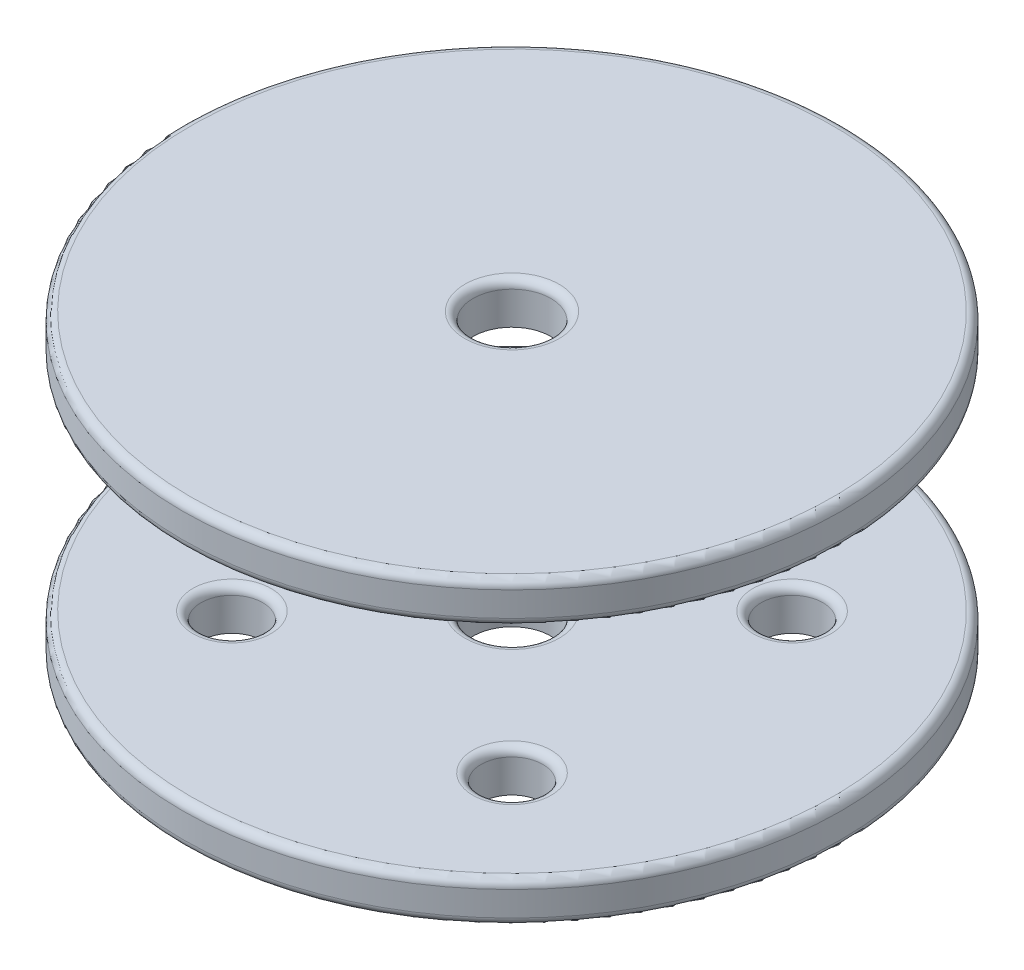
ISO-10303-21;
HEADER;
FILE_DESCRIPTION(('STEP AP214'),'2;1');
FILE_NAME('part.step','',(''),(''),'','','');
FILE_SCHEMA(('AUTOMOTIVE_DESIGN { 1 0 10303 214 1 1 1 1 }'));
ENDSEC;
DATA;
#1=APPLICATION_CONTEXT('core data for automotive mechanical design processes');
#2=APPLICATION_PROTOCOL_DEFINITION('international standard','automotive_design',2000,#1);
#3=PRODUCT_CONTEXT('',#1,'mechanical');
#4=PRODUCT('Part','Part','',(#3));
#5=PRODUCT_RELATED_PRODUCT_CATEGORY('part','',(#4));
#6=PRODUCT_DEFINITION_FORMATION('','',#4);
#7=PRODUCT_DEFINITION_CONTEXT('part definition',#1,'design');
#8=PRODUCT_DEFINITION('design','',#6,#7);
#9=PRODUCT_DEFINITION_SHAPE('','',#8);
#10=(LENGTH_UNIT() NAMED_UNIT(*) SI_UNIT(.MILLI.,.METRE.));
#11=(NAMED_UNIT(*) PLANE_ANGLE_UNIT() SI_UNIT($,.RADIAN.));
#12=(NAMED_UNIT(*) SI_UNIT($,.STERADIAN.) SOLID_ANGLE_UNIT());
#13=UNCERTAINTY_MEASURE_WITH_UNIT(LENGTH_MEASURE(1.E-05),#10,'distance_accuracy_value','');
#14=(GEOMETRIC_REPRESENTATION_CONTEXT(3) GLOBAL_UNCERTAINTY_ASSIGNED_CONTEXT((#13)) GLOBAL_UNIT_ASSIGNED_CONTEXT((#10,
#11,#12)) REPRESENTATION_CONTEXT('',''));
#15=CARTESIAN_POINT('',(0.,0.,0.));
#16=DIRECTION('',(0.,0.,1.));
#17=DIRECTION('',(1.,0.,0.));
#18=AXIS2_PLACEMENT_3D('',#15,#16,#17);
#19=CARTESIAN_POINT('',(0.,46.35000001,0.));
#20=DIRECTION('',(0.,-1.,0.));
#21=DIRECTION('',(0.,0.,-1.));
#22=AXIS2_PLACEMENT_3D('',#19,#20,#21);
#23=CYLINDRICAL_SURFACE('',#22,50.8);
#24=CARTESIAN_POINT('',(0.,41.27000001,0.));
#25=DIRECTION('',(0.,1.,0.));
#26=DIRECTION('',(0.,0.,1.));
#27=AXIS2_PLACEMENT_3D('',#24,#25,#26);
#28=CIRCLE('',#27,50.8);
#29=CARTESIAN_POINT('',(0.,41.27000001,50.8));
#30=VERTEX_POINT('',#29);
#31=EDGE_CURVE('E48',#30,#30,#28,.T.);
#32=ORIENTED_EDGE('',*,*,#31,.T.);
#33=EDGE_LOOP('',(#32));
#34=FACE_BOUND('',#33,.T.);
#35=CARTESIAN_POINT('',(0.,45.08000001,0.));
#36=DIRECTION('',(0.,1.,0.));
#37=DIRECTION('',(0.,0.,1.));
#38=AXIS2_PLACEMENT_3D('',#35,#36,#37);
#39=CIRCLE('',#38,50.8);
#40=CARTESIAN_POINT('',(0.,45.08000001,50.8));
#41=VERTEX_POINT('',#40);
#42=EDGE_CURVE('E52',#41,#41,#39,.F.);
#43=ORIENTED_EDGE('',*,*,#42,.T.);
#44=EDGE_LOOP('',(#43));
#45=FACE_BOUND('',#44,.T.);
#46=ADVANCED_FACE('F41',(#34,#45),#23,.T.);
#47=CARTESIAN_POINT('',(0.,46.35000001,0.));
#48=DIRECTION('',(0.,1.,0.));
#49=DIRECTION('',(0.,0.,1.));
#50=AXIS2_PLACEMENT_3D('',#47,#48,#49);
#51=PLANE('',#50);
#52=CARTESIAN_POINT('',(0.,46.35000001,0.));
#53=DIRECTION('',(0.,1.,0.));
#54=DIRECTION('',(0.,0.,1.));
#55=AXIS2_PLACEMENT_3D('',#52,#53,#54);
#56=CIRCLE('',#55,49.53);
#57=CARTESIAN_POINT('',(0.,46.35000001,49.53));
#58=VERTEX_POINT('',#57);
#59=EDGE_CURVE('E56',#58,#58,#56,.T.);
#60=ORIENTED_EDGE('',*,*,#59,.T.);
#61=EDGE_LOOP('',(#60));
#62=FACE_BOUND('',#61,.T.);
#63=CARTESIAN_POINT('',(0.,46.35000001,0.));
#64=DIRECTION('',(0.,1.,0.));
#65=DIRECTION('',(0.,0.,1.));
#66=AXIS2_PLACEMENT_3D('',#63,#64,#65);
#67=CIRCLE('',#66,7.27);
#68=CARTESIAN_POINT('',(0.,46.35000001,7.27));
#69=VERTEX_POINT('',#68);
#70=EDGE_CURVE('E61',#69,#69,#67,.F.);
#71=ORIENTED_EDGE('',*,*,#70,.T.);
#72=EDGE_LOOP('',(#71));
#73=FACE_BOUND('',#72,.T.);
#74=ADVANCED_FACE('F85',(#62,#73),#51,.T.);
#75=CARTESIAN_POINT('',(0.,40.00000001,0.));
#76=DIRECTION('',(0.,1.,0.));
#77=DIRECTION('',(0.,0.,1.));
#78=AXIS2_PLACEMENT_3D('',#75,#76,#77);
#79=PLANE('',#78);
#80=CARTESIAN_POINT('',(0.,40.00000001,0.));
#81=DIRECTION('',(0.,1.,0.));
#82=DIRECTION('',(0.,0.,1.));
#83=AXIS2_PLACEMENT_3D('',#80,#81,#82);
#84=CIRCLE('',#83,49.53);
#85=CARTESIAN_POINT('',(0.,40.00000001,49.53));
#86=VERTEX_POINT('',#85);
#87=EDGE_CURVE('E11',#86,#86,#84,.F.);
#88=ORIENTED_EDGE('',*,*,#87,.T.);
#89=EDGE_LOOP('',(#88));
#90=FACE_BOUND('',#89,.T.);
#91=CARTESIAN_POINT('',(0.,40.00000001,0.));
#92=DIRECTION('',(0.,1.,0.));
#93=DIRECTION('',(0.,0.,1.));
#94=AXIS2_PLACEMENT_3D('',#91,#92,#93);
#95=CIRCLE('',#94,6.);
#96=CARTESIAN_POINT('',(0.,40.00000001,6.));
#97=VERTEX_POINT('',#96);
#98=EDGE_CURVE('E67',#97,#97,#95,.T.);
#99=ORIENTED_EDGE('',*,*,#98,.T.);
#100=EDGE_LOOP('',(#99));
#101=FACE_BOUND('',#100,.T.);
#102=ADVANCED_FACE('F71',(#90,#101),#79,.F.);
#103=CARTESIAN_POINT('',(0.,46.35000001,0.));
#104=DIRECTION('',(0.,-1.,0.));
#105=DIRECTION('',(0.,0.,-1.));
#106=AXIS2_PLACEMENT_3D('',#103,#104,#105);
#107=CYLINDRICAL_SURFACE('',#106,6.);
#108=CARTESIAN_POINT('',(0.,45.08000001,0.));
#109=DIRECTION('',(0.,1.,0.));
#110=DIRECTION('',(0.,0.,1.));
#111=AXIS2_PLACEMENT_3D('',#108,#109,#110);
#112=CIRCLE('',#111,6.);
#113=CARTESIAN_POINT('',(0.,45.08000001,6.));
#114=VERTEX_POINT('',#113);
#115=EDGE_CURVE('E64',#114,#114,#112,.T.);
#116=ORIENTED_EDGE('',*,*,#115,.T.);
#117=EDGE_LOOP('',(#116));
#118=FACE_BOUND('',#117,.T.);
#119=ORIENTED_EDGE('',*,*,#98,.F.);
#120=EDGE_LOOP('',(#119));
#121=FACE_BOUND('',#120,.T.);
#122=ADVANCED_FACE('F73',(#118,#121),#107,.F.);
#123=CARTESIAN_POINT('',(0.,45.08000001,0.));
#124=DIRECTION('',(0.,1.,0.));
#125=DIRECTION('',(0.,0.,1.));
#126=AXIS2_PLACEMENT_3D('',#123,#124,#125);
#127=TOROIDAL_SURFACE('',#126,7.27,1.27);
#128=ORIENTED_EDGE('',*,*,#70,.F.);
#129=EDGE_LOOP('',(#128));
#130=FACE_BOUND('',#129,.T.);
#131=ORIENTED_EDGE('',*,*,#115,.F.);
#132=EDGE_LOOP('',(#131));
#133=FACE_BOUND('',#132,.T.);
#134=ADVANCED_FACE('F75',(#130,#133),#127,.T.);
#135=CARTESIAN_POINT('',(0.,45.08000001,0.));
#136=DIRECTION('',(0.,1.,0.));
#137=DIRECTION('',(0.,0.,1.));
#138=AXIS2_PLACEMENT_3D('',#135,#136,#137);
#139=TOROIDAL_SURFACE('',#138,49.53,1.27);
#140=ORIENTED_EDGE('',*,*,#42,.F.);
#141=EDGE_LOOP('',(#140));
#142=FACE_BOUND('',#141,.T.);
#143=ORIENTED_EDGE('',*,*,#59,.F.);
#144=EDGE_LOOP('',(#143));
#145=FACE_BOUND('',#144,.T.);
#146=ADVANCED_FACE('F82',(#142,#145),#139,.T.);
#147=CARTESIAN_POINT('',(0.,41.27000001,0.));
#148=DIRECTION('',(0.,1.,0.));
#149=DIRECTION('',(0.,0.,1.));
#150=AXIS2_PLACEMENT_3D('',#147,#148,#149);
#151=TOROIDAL_SURFACE('',#150,49.53,1.27);
#152=ORIENTED_EDGE('',*,*,#87,.F.);
#153=EDGE_LOOP('',(#152));
#154=FACE_BOUND('',#153,.T.);
#155=ORIENTED_EDGE('',*,*,#31,.F.);
#156=EDGE_LOOP('',(#155));
#157=FACE_BOUND('',#156,.T.);
#158=ADVANCED_FACE('F43',(#154,#157),#151,.T.);
#159=CLOSED_SHELL('',(#46,#74,#102,#122,#134,#146,#158));
#160=MANIFOLD_SOLID_BREP('B2',#159);
#161=CARTESIAN_POINT('',(0.,6.35,0.));
#162=DIRECTION('',(0.,-1.,0.));
#163=DIRECTION('',(0.,0.,-1.));
#164=AXIS2_PLACEMENT_3D('',#161,#162,#163);
#165=CYLINDRICAL_SURFACE('',#164,50.8);
#166=CARTESIAN_POINT('',(0.,1.27,0.));
#167=DIRECTION('',(0.,1.,0.));
#168=DIRECTION('',(0.,0.,1.));
#169=AXIS2_PLACEMENT_3D('',#166,#167,#168);
#170=CIRCLE('',#169,50.8);
#171=CARTESIAN_POINT('',(0.,1.27,50.8));
#172=VERTEX_POINT('',#171);
#173=EDGE_CURVE('E163',#172,#172,#170,.T.);
#174=ORIENTED_EDGE('',*,*,#173,.T.);
#175=EDGE_LOOP('',(#174));
#176=FACE_BOUND('',#175,.T.);
#177=CARTESIAN_POINT('',(0.,5.08,0.));
#178=DIRECTION('',(0.,1.,0.));
#179=DIRECTION('',(0.,0.,1.));
#180=AXIS2_PLACEMENT_3D('',#177,#178,#179);
#181=CIRCLE('',#180,50.8);
#182=CARTESIAN_POINT('',(0.,5.08,50.8));
#183=VERTEX_POINT('',#182);
#184=EDGE_CURVE('E168',#183,#183,#181,.F.);
#185=ORIENTED_EDGE('',*,*,#184,.T.);
#186=EDGE_LOOP('',(#185));
#187=FACE_BOUND('',#186,.T.);
#188=ADVANCED_FACE('F148',(#176,#187),#165,.T.);
#189=CARTESIAN_POINT('',(0.,6.35,0.));
#190=DIRECTION('',(0.,1.,0.));
#191=DIRECTION('',(0.,0.,1.));
#192=AXIS2_PLACEMENT_3D('',#189,#190,#191);
#193=PLANE('',#192);
#194=CARTESIAN_POINT('',(0.,6.35,0.));
#195=DIRECTION('',(0.,1.,0.));
#196=DIRECTION('',(0.,0.,1.));
#197=AXIS2_PLACEMENT_3D('',#194,#195,#196);
#198=CIRCLE('',#197,7.27);
#199=CARTESIAN_POINT('',(0.,6.35,7.27));
#200=VERTEX_POINT('',#199);
#201=EDGE_CURVE('E40',#200,#200,#198,.F.);
#202=ORIENTED_EDGE('',*,*,#201,.T.);
#203=EDGE_LOOP('',(#202));
#204=FACE_BOUND('',#203,.T.);
#205=CARTESIAN_POINT('',(0.,6.35,0.));
#206=DIRECTION('',(0.,1.,0.));
#207=DIRECTION('',(0.,0.,1.));
#208=AXIS2_PLACEMENT_3D('',#205,#206,#207);
#209=CIRCLE('',#208,49.53);
#210=CARTESIAN_POINT('',(0.,6.35,49.53));
#211=VERTEX_POINT('',#210);
#212=EDGE_CURVE('E171',#211,#211,#209,.T.);
#213=ORIENTED_EDGE('',*,*,#212,.T.);
#214=EDGE_LOOP('',(#213));
#215=FACE_BOUND('',#214,.T.);
#216=CARTESIAN_POINT('',(21.59,6.35,-21.59));
#217=DIRECTION('',(0.,1.,0.));
#218=DIRECTION('',(0.,0.,1.));
#219=AXIS2_PLACEMENT_3D('',#216,#217,#218);
#220=CIRCLE('',#219,6.0325);
#221=CARTESIAN_POINT('',(21.59,6.35,-15.5575));
#222=VERTEX_POINT('',#221);
#223=EDGE_CURVE('E183',#222,#222,#220,.F.);
#224=ORIENTED_EDGE('',*,*,#223,.T.);
#225=EDGE_LOOP('',(#224));
#226=FACE_BOUND('',#225,.T.);
#227=CARTESIAN_POINT('',(21.59,6.35,21.59));
#228=DIRECTION('',(0.,1.,0.));
#229=DIRECTION('',(0.,0.,1.));
#230=AXIS2_PLACEMENT_3D('',#227,#228,#229);
#231=CIRCLE('',#230,6.0325);
#232=CARTESIAN_POINT('',(21.59,6.35,27.6225));
#233=VERTEX_POINT('',#232);
#234=EDGE_CURVE('E186',#233,#233,#231,.F.);
#235=ORIENTED_EDGE('',*,*,#234,.T.);
#236=EDGE_LOOP('',(#235));
#237=FACE_BOUND('',#236,.T.);
#238=CARTESIAN_POINT('',(-21.59,6.35,21.59));
#239=DIRECTION('',(0.,1.,0.));
#240=DIRECTION('',(0.,0.,1.));
#241=AXIS2_PLACEMENT_3D('',#238,#239,#240);
#242=CIRCLE('',#241,6.0325);
#243=CARTESIAN_POINT('',(-21.59,6.35,27.6225));
#244=VERTEX_POINT('',#243);
#245=EDGE_CURVE('E189',#244,#244,#242,.F.);
#246=ORIENTED_EDGE('',*,*,#245,.T.);
#247=EDGE_LOOP('',(#246));
#248=FACE_BOUND('',#247,.T.);
#249=CARTESIAN_POINT('',(-21.59,6.35,-21.59));
#250=DIRECTION('',(0.,1.,0.));
#251=DIRECTION('',(0.,0.,1.));
#252=AXIS2_PLACEMENT_3D('',#249,#250,#251);
#253=CIRCLE('',#252,6.0325);
#254=CARTESIAN_POINT('',(-21.59,6.35,-15.5575));
#255=VERTEX_POINT('',#254);
#256=EDGE_CURVE('E192',#255,#255,#253,.F.);
#257=ORIENTED_EDGE('',*,*,#256,.T.);
#258=EDGE_LOOP('',(#257));
#259=FACE_BOUND('',#258,.T.);
#260=ADVANCED_FACE('F232',(#204,#215,#226,#237,#248,#259),#193,.T.);
#261=CARTESIAN_POINT('',(0.,0.,0.));
#262=DIRECTION('',(0.,1.,0.));
#263=DIRECTION('',(0.,0.,1.));
#264=AXIS2_PLACEMENT_3D('',#261,#262,#263);
#265=PLANE('',#264);
#266=CARTESIAN_POINT('',(0.,0.,0.));
#267=DIRECTION('',(0.,1.,0.));
#268=DIRECTION('',(0.,0.,1.));
#269=AXIS2_PLACEMENT_3D('',#266,#267,#268);
#270=CIRCLE('',#269,49.53);
#271=CARTESIAN_POINT('',(0.,0.,49.53));
#272=VERTEX_POINT('',#271);
#273=EDGE_CURVE('E159',#272,#272,#270,.F.);
#274=ORIENTED_EDGE('',*,*,#273,.T.);
#275=EDGE_LOOP('',(#274));
#276=FACE_BOUND('',#275,.T.);
#277=CARTESIAN_POINT('',(21.59,0.,-21.59));
#278=DIRECTION('',(0.,1.,0.));
#279=DIRECTION('',(0.,0.,-1.));
#280=AXIS2_PLACEMENT_3D('',#277,#278,#279);
#281=CIRCLE('',#280,4.7625);
#282=CARTESIAN_POINT('',(21.59,0.,-26.3525));
#283=VERTEX_POINT('',#282);
#284=EDGE_CURVE('E202',#283,#283,#281,.T.);
#285=ORIENTED_EDGE('',*,*,#284,.T.);
#286=EDGE_LOOP('',(#285));
#287=FACE_BOUND('',#286,.T.);
#288=CARTESIAN_POINT('',(21.59,0.,21.59));
#289=DIRECTION('',(0.,1.,0.));
#290=DIRECTION('',(0.,0.,1.));
#291=AXIS2_PLACEMENT_3D('',#288,#289,#290);
#292=CIRCLE('',#291,4.7625);
#293=CARTESIAN_POINT('',(21.59,0.,26.3525));
#294=VERTEX_POINT('',#293);
#295=EDGE_CURVE('E205',#294,#294,#292,.T.);
#296=ORIENTED_EDGE('',*,*,#295,.T.);
#297=EDGE_LOOP('',(#296));
#298=FACE_BOUND('',#297,.T.);
#299=CARTESIAN_POINT('',(-21.59,0.,21.59));
#300=DIRECTION('',(0.,1.,0.));
#301=DIRECTION('',(0.,0.,-1.));
#302=AXIS2_PLACEMENT_3D('',#299,#300,#301);
#303=CIRCLE('',#302,4.7625);
#304=CARTESIAN_POINT('',(-21.59,0.,16.8275));
#305=VERTEX_POINT('',#304);
#306=EDGE_CURVE('E208',#305,#305,#303,.T.);
#307=ORIENTED_EDGE('',*,*,#306,.T.);
#308=EDGE_LOOP('',(#307));
#309=FACE_BOUND('',#308,.T.);
#310=CARTESIAN_POINT('',(-21.59,0.,-21.59));
#311=DIRECTION('',(0.,1.,0.));
#312=DIRECTION('',(0.,0.,1.));
#313=AXIS2_PLACEMENT_3D('',#310,#311,#312);
#314=CIRCLE('',#313,4.7625);
#315=CARTESIAN_POINT('',(-21.59,0.,-16.8275));
#316=VERTEX_POINT('',#315);
#317=EDGE_CURVE('E201',#316,#316,#314,.T.);
#318=ORIENTED_EDGE('',*,*,#317,.T.);
#319=EDGE_LOOP('',(#318));
#320=FACE_BOUND('',#319,.T.);
#321=CARTESIAN_POINT('',(0.,0.,0.));
#322=DIRECTION('',(0.,1.,0.));
#323=DIRECTION('',(0.,0.,1.));
#324=AXIS2_PLACEMENT_3D('',#321,#322,#323);
#325=CIRCLE('',#324,6.);
#326=CARTESIAN_POINT('',(0.,0.,6.));
#327=VERTEX_POINT('',#326);
#328=EDGE_CURVE('E198',#327,#327,#325,.T.);
#329=ORIENTED_EDGE('',*,*,#328,.T.);
#330=EDGE_LOOP('',(#329));
#331=FACE_BOUND('',#330,.T.);
#332=ADVANCED_FACE('F214',(#276,#287,#298,#309,#320,#331),#265,.F.);
#333=CARTESIAN_POINT('',(0.,0.,0.));
#334=DIRECTION('',(0.,1.,0.));
#335=DIRECTION('',(0.,0.,1.));
#336=AXIS2_PLACEMENT_3D('',#333,#334,#335);
#337=CYLINDRICAL_SURFACE('',#336,6.);
#338=CARTESIAN_POINT('',(0.,5.08,0.));
#339=DIRECTION('',(0.,1.,0.));
#340=DIRECTION('',(0.,0.,1.));
#341=AXIS2_PLACEMENT_3D('',#338,#339,#340);
#342=CIRCLE('',#341,6.);
#343=CARTESIAN_POINT('',(0.,5.08,6.));
#344=VERTEX_POINT('',#343);
#345=EDGE_CURVE('E155',#344,#344,#342,.T.);
#346=ORIENTED_EDGE('',*,*,#345,.T.);
#347=EDGE_LOOP('',(#346));
#348=FACE_BOUND('',#347,.T.);
#349=ORIENTED_EDGE('',*,*,#328,.F.);
#350=EDGE_LOOP('',(#349));
#351=FACE_BOUND('',#350,.T.);
#352=ADVANCED_FACE('F220',(#348,#351),#337,.F.);
#353=CARTESIAN_POINT('',(-21.59,0.,-21.59));
#354=DIRECTION('',(0.,1.,0.));
#355=DIRECTION('',(0.,0.,1.));
#356=AXIS2_PLACEMENT_3D('',#353,#354,#355);
#357=CYLINDRICAL_SURFACE('',#356,4.7625);
#358=CARTESIAN_POINT('',(-21.59,5.08,-21.59));
#359=DIRECTION('',(0.,1.,0.));
#360=DIRECTION('',(0.,0.,1.));
#361=AXIS2_PLACEMENT_3D('',#358,#359,#360);
#362=CIRCLE('',#361,4.7625);
#363=CARTESIAN_POINT('',(-21.59,5.08,-16.8275));
#364=VERTEX_POINT('',#363);
#365=EDGE_CURVE('E174',#364,#364,#362,.T.);
#366=ORIENTED_EDGE('',*,*,#365,.T.);
#367=EDGE_LOOP('',(#366));
#368=FACE_BOUND('',#367,.T.);
#369=ORIENTED_EDGE('',*,*,#317,.F.);
#370=EDGE_LOOP('',(#369));
#371=FACE_BOUND('',#370,.T.);
#372=ADVANCED_FACE('F217',(#368,#371),#357,.F.);
#373=CARTESIAN_POINT('',(-21.59,0.,21.59));
#374=DIRECTION('',(0.,1.,0.));
#375=DIRECTION('',(0.,0.,1.));
#376=AXIS2_PLACEMENT_3D('',#373,#374,#375);
#377=CYLINDRICAL_SURFACE('',#376,4.7625);
#378=CARTESIAN_POINT('',(-21.59,5.08,21.59));
#379=DIRECTION('',(0.,1.,0.));
#380=DIRECTION('',(0.,0.,1.));
#381=AXIS2_PLACEMENT_3D('',#378,#379,#380);
#382=CIRCLE('',#381,4.7625);
#383=CARTESIAN_POINT('',(-21.59,5.08,26.3525));
#384=VERTEX_POINT('',#383);
#385=EDGE_CURVE('E177',#384,#384,#382,.T.);
#386=ORIENTED_EDGE('',*,*,#385,.T.);
#387=EDGE_LOOP('',(#386));
#388=FACE_BOUND('',#387,.T.);
#389=ORIENTED_EDGE('',*,*,#306,.F.);
#390=EDGE_LOOP('',(#389));
#391=FACE_BOUND('',#390,.T.);
#392=ADVANCED_FACE('F219',(#388,#391),#377,.F.);
#393=CARTESIAN_POINT('',(21.59,0.,21.59));
#394=DIRECTION('',(0.,1.,0.));
#395=DIRECTION('',(0.,0.,1.));
#396=AXIS2_PLACEMENT_3D('',#393,#394,#395);
#397=CYLINDRICAL_SURFACE('',#396,4.7625);
#398=CARTESIAN_POINT('',(21.59,5.08,21.59));
#399=DIRECTION('',(0.,1.,0.));
#400=DIRECTION('',(0.,0.,1.));
#401=AXIS2_PLACEMENT_3D('',#398,#399,#400);
#402=CIRCLE('',#401,4.7625);
#403=CARTESIAN_POINT('',(21.59,5.08,26.3525));
#404=VERTEX_POINT('',#403);
#405=EDGE_CURVE('E180',#404,#404,#402,.T.);
#406=ORIENTED_EDGE('',*,*,#405,.T.);
#407=EDGE_LOOP('',(#406));
#408=FACE_BOUND('',#407,.T.);
#409=ORIENTED_EDGE('',*,*,#295,.F.);
#410=EDGE_LOOP('',(#409));
#411=FACE_BOUND('',#410,.T.);
#412=ADVANCED_FACE('F227',(#408,#411),#397,.F.);
#413=CARTESIAN_POINT('',(21.59,0.,-21.59));
#414=DIRECTION('',(0.,1.,0.));
#415=DIRECTION('',(0.,0.,1.));
#416=AXIS2_PLACEMENT_3D('',#413,#414,#415);
#417=CYLINDRICAL_SURFACE('',#416,4.7625);
#418=CARTESIAN_POINT('',(21.59,5.08,-21.59));
#419=DIRECTION('',(0.,1.,0.));
#420=DIRECTION('',(0.,0.,1.));
#421=AXIS2_PLACEMENT_3D('',#418,#419,#420);
#422=CIRCLE('',#421,4.7625);
#423=CARTESIAN_POINT('',(21.59,5.08,-16.8275));
#424=VERTEX_POINT('',#423);
#425=EDGE_CURVE('E195',#424,#424,#422,.T.);
#426=ORIENTED_EDGE('',*,*,#425,.T.);
#427=EDGE_LOOP('',(#426));
#428=FACE_BOUND('',#427,.T.);
#429=ORIENTED_EDGE('',*,*,#284,.F.);
#430=EDGE_LOOP('',(#429));
#431=FACE_BOUND('',#430,.T.);
#432=ADVANCED_FACE('F246',(#428,#431),#417,.F.);
#433=CARTESIAN_POINT('',(21.59,5.08,-21.59));
#434=DIRECTION('',(0.,1.,0.));
#435=DIRECTION('',(0.,0.,1.));
#436=AXIS2_PLACEMENT_3D('',#433,#434,#435);
#437=TOROIDAL_SURFACE('',#436,6.0325,1.27);
#438=ORIENTED_EDGE('',*,*,#223,.F.);
#439=EDGE_LOOP('',(#438));
#440=FACE_BOUND('',#439,.T.);
#441=ORIENTED_EDGE('',*,*,#425,.F.);
#442=EDGE_LOOP('',(#441));
#443=FACE_BOUND('',#442,.T.);
#444=ADVANCED_FACE('F242',(#440,#443),#437,.T.);
#445=CARTESIAN_POINT('',(21.59,5.08,21.59));
#446=DIRECTION('',(0.,1.,0.));
#447=DIRECTION('',(0.,0.,1.));
#448=AXIS2_PLACEMENT_3D('',#445,#446,#447);
#449=TOROIDAL_SURFACE('',#448,6.0325,1.27);
#450=ORIENTED_EDGE('',*,*,#234,.F.);
#451=EDGE_LOOP('',(#450));
#452=FACE_BOUND('',#451,.T.);
#453=ORIENTED_EDGE('',*,*,#405,.F.);
#454=EDGE_LOOP('',(#453));
#455=FACE_BOUND('',#454,.T.);
#456=ADVANCED_FACE('F245',(#452,#455),#449,.T.);
#457=CARTESIAN_POINT('',(-21.59,5.08,21.59));
#458=DIRECTION('',(0.,1.,0.));
#459=DIRECTION('',(0.,0.,1.));
#460=AXIS2_PLACEMENT_3D('',#457,#458,#459);
#461=TOROIDAL_SURFACE('',#460,6.0325,1.27);
#462=ORIENTED_EDGE('',*,*,#245,.F.);
#463=EDGE_LOOP('',(#462));
#464=FACE_BOUND('',#463,.T.);
#465=ORIENTED_EDGE('',*,*,#385,.F.);
#466=EDGE_LOOP('',(#465));
#467=FACE_BOUND('',#466,.T.);
#468=ADVANCED_FACE('F250',(#464,#467),#461,.T.);
#469=CARTESIAN_POINT('',(-21.59,5.08,-21.59));
#470=DIRECTION('',(0.,1.,0.));
#471=DIRECTION('',(0.,0.,1.));
#472=AXIS2_PLACEMENT_3D('',#469,#470,#471);
#473=TOROIDAL_SURFACE('',#472,6.0325,1.27);
#474=ORIENTED_EDGE('',*,*,#256,.F.);
#475=EDGE_LOOP('',(#474));
#476=FACE_BOUND('',#475,.T.);
#477=ORIENTED_EDGE('',*,*,#365,.F.);
#478=EDGE_LOOP('',(#477));
#479=FACE_BOUND('',#478,.T.);
#480=ADVANCED_FACE('F254',(#476,#479),#473,.T.);
#481=CARTESIAN_POINT('',(0.,5.08,0.));
#482=DIRECTION('',(0.,1.,0.));
#483=DIRECTION('',(0.,0.,1.));
#484=AXIS2_PLACEMENT_3D('',#481,#482,#483);
#485=TOROIDAL_SURFACE('',#484,49.53,1.27);
#486=ORIENTED_EDGE('',*,*,#184,.F.);
#487=EDGE_LOOP('',(#486));
#488=FACE_BOUND('',#487,.T.);
#489=ORIENTED_EDGE('',*,*,#212,.F.);
#490=EDGE_LOOP('',(#489));
#491=FACE_BOUND('',#490,.T.);
#492=ADVANCED_FACE('F258',(#488,#491),#485,.T.);
#493=CARTESIAN_POINT('',(0.,1.27,0.));
#494=DIRECTION('',(0.,1.,0.));
#495=DIRECTION('',(0.,0.,1.));
#496=AXIS2_PLACEMENT_3D('',#493,#494,#495);
#497=TOROIDAL_SURFACE('',#496,49.53,1.27);
#498=ORIENTED_EDGE('',*,*,#273,.F.);
#499=EDGE_LOOP('',(#498));
#500=FACE_BOUND('',#499,.T.);
#501=ORIENTED_EDGE('',*,*,#173,.F.);
#502=EDGE_LOOP('',(#501));
#503=FACE_BOUND('',#502,.T.);
#504=ADVANCED_FACE('F261',(#500,#503),#497,.T.);
#505=CARTESIAN_POINT('',(0.,5.08,0.));
#506=DIRECTION('',(0.,1.,0.));
#507=DIRECTION('',(0.,0.,1.));
#508=AXIS2_PLACEMENT_3D('',#505,#506,#507);
#509=TOROIDAL_SURFACE('',#508,7.27,1.27);
#510=ORIENTED_EDGE('',*,*,#201,.F.);
#511=EDGE_LOOP('',(#510));
#512=FACE_BOUND('',#511,.T.);
#513=ORIENTED_EDGE('',*,*,#345,.F.);
#514=EDGE_LOOP('',(#513));
#515=FACE_BOUND('',#514,.T.);
#516=ADVANCED_FACE('F150',(#512,#515),#509,.T.);
#517=CLOSED_SHELL('',(#188,#260,#332,#352,#372,#392,#412,#432,#444,#456,#468,#480,#492,#504,#516));
#518=MANIFOLD_SOLID_BREP('B6',#517);
#519=ADVANCED_BREP_SHAPE_REPRESENTATION('',(#18,#160,#518),#14);
#520=SHAPE_DEFINITION_REPRESENTATION(#9,#519);
ENDSEC;
END-ISO-10303-21;
